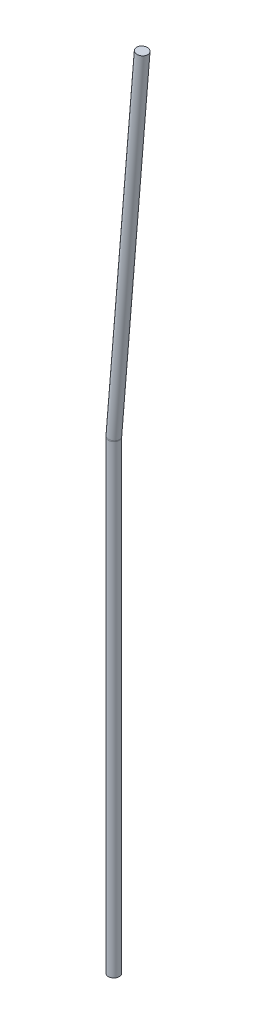
ISO-10303-21;
HEADER;
FILE_DESCRIPTION(('STEP AP214'),'2;1');
FILE_NAME('part.step','',(''),(''),'','','');
FILE_SCHEMA(('AUTOMOTIVE_DESIGN { 1 0 10303 214 1 1 1 1 }'));
ENDSEC;
DATA;
#1=APPLICATION_CONTEXT('core data for automotive mechanical design processes');
#2=APPLICATION_PROTOCOL_DEFINITION('international standard','automotive_design',2000,#1);
#3=PRODUCT_CONTEXT('',#1,'mechanical');
#4=PRODUCT('Part','Part','',(#3));
#5=PRODUCT_RELATED_PRODUCT_CATEGORY('part','',(#4));
#6=PRODUCT_DEFINITION_FORMATION('','',#4);
#7=PRODUCT_DEFINITION_CONTEXT('part definition',#1,'design');
#8=PRODUCT_DEFINITION('design','',#6,#7);
#9=PRODUCT_DEFINITION_SHAPE('','',#8);
#10=(LENGTH_UNIT() NAMED_UNIT(*) SI_UNIT(.MILLI.,.METRE.));
#11=(NAMED_UNIT(*) PLANE_ANGLE_UNIT() SI_UNIT($,.RADIAN.));
#12=(NAMED_UNIT(*) SI_UNIT($,.STERADIAN.) SOLID_ANGLE_UNIT());
#13=UNCERTAINTY_MEASURE_WITH_UNIT(LENGTH_MEASURE(1.E-05),#10,'distance_accuracy_value','');
#14=(GEOMETRIC_REPRESENTATION_CONTEXT(3) GLOBAL_UNCERTAINTY_ASSIGNED_CONTEXT((#13)) GLOBAL_UNIT_ASSIGNED_CONTEXT((#10,
#11,#12)) REPRESENTATION_CONTEXT('',''));
#15=CARTESIAN_POINT('',(0.,0.,0.));
#16=DIRECTION('',(0.,0.,1.));
#17=DIRECTION('',(1.,0.,0.));
#18=AXIS2_PLACEMENT_3D('',#15,#16,#17);
#19=CARTESIAN_POINT('',(0.,-16.65,0.));
#20=DIRECTION('',(0.,1.,0.));
#21=DIRECTION('',(0.,0.,1.));
#22=AXIS2_PLACEMENT_3D('',#19,#20,#21);
#23=CYLINDRICAL_SURFACE('',#22,0.2);
#24=CARTESIAN_POINT('',(0.,-16.65,0.));
#25=DIRECTION('',(0.,1.,0.));
#26=DIRECTION('',(0.,0.,1.));
#27=AXIS2_PLACEMENT_3D('',#24,#25,#26);
#28=CIRCLE('',#27,0.2);
#29=CARTESIAN_POINT('',(0.,-16.65,0.2));
#30=VERTEX_POINT('',#29);
#31=EDGE_CURVE('E10',#30,#30,#28,.T.);
#32=ORIENTED_EDGE('',*,*,#31,.T.);
#33=EDGE_LOOP('',(#32));
#34=FACE_BOUND('',#33,.T.);
#35=CARTESIAN_POINT('',(0.,0.,0.));
#36=DIRECTION('',(0.,1.,0.));
#37=DIRECTION('',(0.,0.,1.));
#38=AXIS2_PLACEMENT_3D('',#35,#36,#37);
#39=CIRCLE('',#38,0.2);
#40=CARTESIAN_POINT('',(-0.2,0.,0.));
#41=VERTEX_POINT('',#40);
#42=EDGE_CURVE('E37',#41,#41,#39,.T.);
#43=ORIENTED_EDGE('',*,*,#42,.F.);
#44=EDGE_LOOP('',(#43));
#45=FACE_BOUND('',#44,.T.);
#46=ADVANCED_FACE('F34',(#34,#45),#23,.T.);
#47=CARTESIAN_POINT('',(0.,-16.65,0.));
#48=DIRECTION('',(0.,1.,0.));
#49=DIRECTION('',(0.,0.,1.));
#50=AXIS2_PLACEMENT_3D('',#47,#48,#49);
#51=PLANE('',#50);
#52=ORIENTED_EDGE('',*,*,#31,.F.);
#53=EDGE_LOOP('',(#52));
#54=FACE_BOUND('',#53,.T.);
#55=ADVANCED_FACE('F63',(#54),#51,.F.);
#56=CARTESIAN_POINT('',(0.5,0.,0.));
#57=DIRECTION('',(0.,0.,1.));
#58=DIRECTION('',(1.,0.,0.));
#59=AXIS2_PLACEMENT_3D('',#56,#57,#58);
#60=TOROIDAL_SURFACE('',#59,0.5,0.2);
#61=CARTESIAN_POINT('',(0.0016528260953485,0.0406213522823529,0.));
#62=DIRECTION('',(0.0812427045647058,0.996694347809303,0.));
#63=DIRECTION('',(0.,0.,1.));
#64=AXIS2_PLACEMENT_3D('',#61,#62,#63);
#65=CIRCLE('',#64,0.2);
#66=CARTESIAN_POINT('',(-0.197686043466512,0.0568698931952941,0.));
#67=VERTEX_POINT('',#66);
#68=EDGE_CURVE('E44',#67,#67,#65,.T.);
#69=CARTESIAN_POINT('',(0.5,0.,0.));
#70=DIRECTION('',(0.,0.,1.));
#71=DIRECTION('',(1.,0.,0.));
#72=AXIS2_PLACEMENT_3D('',#69,#70,#71);
#73=CIRCLE('',#72,0.7);
#74=EDGE_CURVE('',#67,#41,#73,.T.);
#75=ORIENTED_EDGE('',*,*,#68,.F.);
#76=ORIENTED_EDGE('',*,*,#42,.T.);
#77=ORIENTED_EDGE('',*,*,#74,.T.);
#78=ORIENTED_EDGE('',*,*,#74,.F.);
#79=EDGE_LOOP('',(#75,#77,#76,#78));
#80=FACE_BOUND('',#79,.T.);
#81=ADVANCED_FACE('F57',(#80),#60,.T.);
#82=CARTESIAN_POINT('',(1.01718663315417,12.4993006998986,0.));
#83=DIRECTION('',(-0.0812427045647059,-0.996694347809303,0.));
#84=DIRECTION('',(0.996694347809303,-0.0812427045647059,0.));
#85=AXIS2_PLACEMENT_3D('',#82,#83,#84);
#86=CYLINDRICAL_SURFACE('',#85,0.2);
#87=CARTESIAN_POINT('',(1.01718663315417,12.4993006998986,0.));
#88=DIRECTION('',(0.0812427045647059,0.996694347809303,0.));
#89=DIRECTION('',(-0.996694347809303,0.0812427045647059,0.));
#90=AXIS2_PLACEMENT_3D('',#87,#88,#89);
#91=CIRCLE('',#90,0.2);
#92=CARTESIAN_POINT('',(0.817847763592311,12.5155492408116,0.));
#93=VERTEX_POINT('',#92);
#94=EDGE_CURVE('E48',#93,#93,#91,.T.);
#95=ORIENTED_EDGE('',*,*,#94,.F.);
#96=EDGE_LOOP('',(#95));
#97=FACE_BOUND('',#96,.T.);
#98=ORIENTED_EDGE('',*,*,#68,.T.);
#99=EDGE_LOOP('',(#98));
#100=FACE_BOUND('',#99,.T.);
#101=ADVANCED_FACE('F54',(#97,#100),#86,.T.);
#102=CARTESIAN_POINT('',(1.01718663315417,12.4993006998986,0.));
#103=DIRECTION('',(0.0812427045647059,0.996694347809303,0.));
#104=DIRECTION('',(-0.996694347809303,0.0812427045647059,0.));
#105=AXIS2_PLACEMENT_3D('',#102,#103,#104);
#106=PLANE('',#105);
#107=ORIENTED_EDGE('',*,*,#94,.T.);
#108=EDGE_LOOP('',(#107));
#109=FACE_BOUND('',#108,.T.);
#110=ADVANCED_FACE('F52',(#109),#106,.T.);
#111=CLOSED_SHELL('',(#46,#55,#81,#101,#110));
#112=MANIFOLD_SOLID_BREP('B2',#111);
#113=ADVANCED_BREP_SHAPE_REPRESENTATION('',(#18,#112),#14);
#114=SHAPE_DEFINITION_REPRESENTATION(#9,#113);
ENDSEC;
END-ISO-10303-21;
